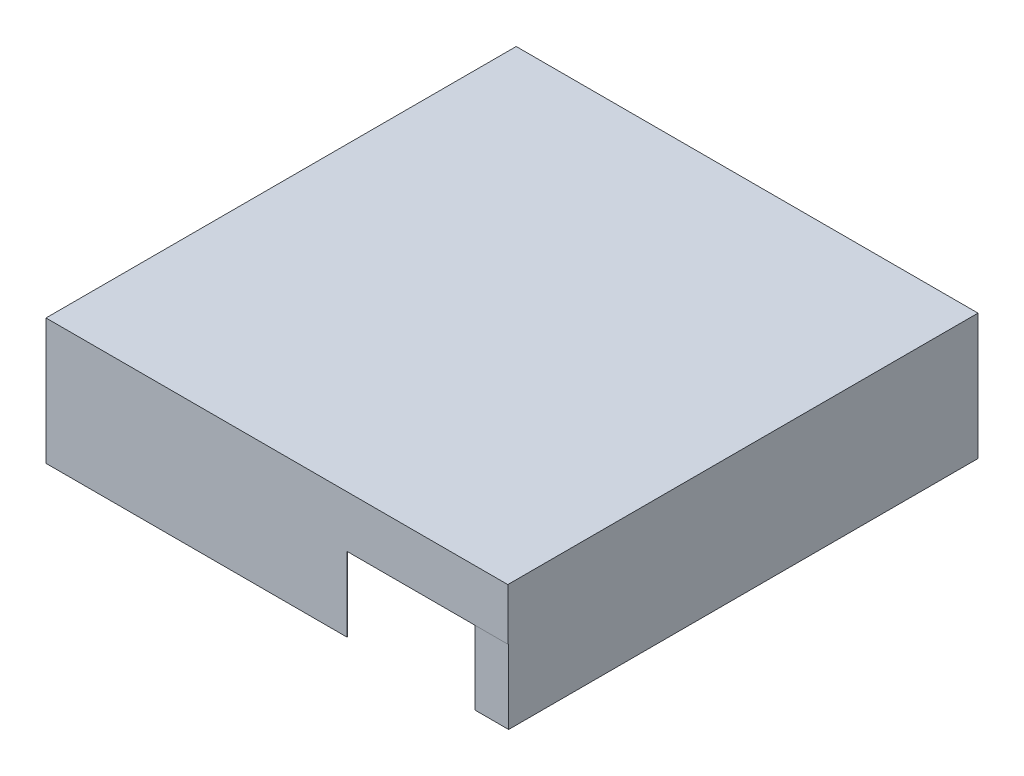
ISO-10303-21;
HEADER;
FILE_DESCRIPTION(('STEP AP214'),'2;1');
FILE_NAME('part.step','',(''),(''),'','','');
FILE_SCHEMA(('AUTOMOTIVE_DESIGN { 1 0 10303 214 1 1 1 1 }'));
ENDSEC;
DATA;
#1=APPLICATION_CONTEXT('core data for automotive mechanical design processes');
#2=APPLICATION_PROTOCOL_DEFINITION('international standard','automotive_design',2000,#1);
#3=PRODUCT_CONTEXT('',#1,'mechanical');
#4=PRODUCT('Part','Part','',(#3));
#5=PRODUCT_RELATED_PRODUCT_CATEGORY('part','',(#4));
#6=PRODUCT_DEFINITION_FORMATION('','',#4);
#7=PRODUCT_DEFINITION_CONTEXT('part definition',#1,'design');
#8=PRODUCT_DEFINITION('design','',#6,#7);
#9=PRODUCT_DEFINITION_SHAPE('','',#8);
#10=(LENGTH_UNIT() NAMED_UNIT(*) SI_UNIT(.MILLI.,.METRE.));
#11=(NAMED_UNIT(*) PLANE_ANGLE_UNIT() SI_UNIT($,.RADIAN.));
#12=(NAMED_UNIT(*) SI_UNIT($,.STERADIAN.) SOLID_ANGLE_UNIT());
#13=UNCERTAINTY_MEASURE_WITH_UNIT(LENGTH_MEASURE(1.E-05),#10,'distance_accuracy_value','');
#14=(GEOMETRIC_REPRESENTATION_CONTEXT(3) GLOBAL_UNCERTAINTY_ASSIGNED_CONTEXT((#13)) GLOBAL_UNIT_ASSIGNED_CONTEXT((#10,
#11,#12)) REPRESENTATION_CONTEXT('',''));
#15=CARTESIAN_POINT('',(0.,0.,0.));
#16=DIRECTION('',(0.,0.,1.));
#17=DIRECTION('',(1.,0.,0.));
#18=AXIS2_PLACEMENT_3D('',#15,#16,#17);
#19=CARTESIAN_POINT('',(0.,0.,0.));
#20=DIRECTION('',(0.,1.,0.));
#21=DIRECTION('',(0.,0.,1.));
#22=AXIS2_PLACEMENT_3D('',#19,#20,#21);
#23=PLANE('',#22);
#24=DIRECTION('',(-1.,0.,0.));
#25=VECTOR('',#24,1.);
#26=CARTESIAN_POINT('',(-11.75,0.,-25.5));
#27=LINE('',#26,#25);
#28=CARTESIAN_POINT('',(-9.25,0.,-25.5));
#29=VERTEX_POINT('',#28);
#30=CARTESIAN_POINT('',(-11.75,0.,-25.5));
#31=VERTEX_POINT('',#30);
#32=EDGE_CURVE('E44',#29,#31,#27,.T.);
#33=ORIENTED_EDGE('',*,*,#32,.T.);
#34=DIRECTION('',(0.,0.,1.));
#35=VECTOR('',#34,1.);
#36=CARTESIAN_POINT('',(-11.75,0.,-0.0500000000000036));
#37=LINE('',#36,#35);
#38=CARTESIAN_POINT('',(-11.75,0.,-0.0500000000000036));
#39=VERTEX_POINT('',#38);
#40=EDGE_CURVE('E278',#31,#39,#37,.T.);
#41=ORIENTED_EDGE('',*,*,#40,.T.);
#42=DIRECTION('',(-1.,0.,0.));
#43=VECTOR('',#42,1.);
#44=CARTESIAN_POINT('',(-11.75,0.,-0.0500000000000036));
#45=LINE('',#44,#43);
#46=CARTESIAN_POINT('',(4.16471791353497,0.,-0.0500000000000049));
#47=VERTEX_POINT('',#46);
#48=EDGE_CURVE('E272',#47,#39,#45,.T.);
#49=ORIENTED_EDGE('',*,*,#48,.F.);
#50=DIRECTION('',(0.,0.,1.));
#51=VECTOR('',#50,1.);
#52=CARTESIAN_POINT('',(4.16471791353497,0.,-13.6995729837994));
#53=LINE('',#52,#51);
#54=CARTESIAN_POINT('',(4.16471791353497,0.,0.));
#55=VERTEX_POINT('',#54);
#56=EDGE_CURVE('E49',#47,#55,#53,.T.);
#57=ORIENTED_EDGE('',*,*,#56,.T.);
#58=DIRECTION('',(1.,0.,0.));
#59=VECTOR('',#58,1.);
#60=CARTESIAN_POINT('',(-13.75,0.,0.));
#61=LINE('',#60,#59);
#62=CARTESIAN_POINT('',(-13.75,0.,0.));
#63=VERTEX_POINT('',#62);
#64=EDGE_CURVE('E281',#63,#55,#61,.T.);
#65=ORIENTED_EDGE('',*,*,#64,.F.);
#66=DIRECTION('',(0.,0.,1.));
#67=VECTOR('',#66,1.);
#68=CARTESIAN_POINT('',(-13.75,0.,0.));
#69=LINE('',#68,#67);
#70=CARTESIAN_POINT('',(-13.75,0.,-28.));
#71=VERTEX_POINT('',#70);
#72=EDGE_CURVE('E269',#71,#63,#69,.T.);
#73=ORIENTED_EDGE('',*,*,#72,.F.);
#74=DIRECTION('',(-1.,0.,0.));
#75=VECTOR('',#74,1.);
#76=CARTESIAN_POINT('',(-13.75,0.,-28.));
#77=LINE('',#76,#75);
#78=CARTESIAN_POINT('',(-9.25,0.,-28.));
#79=VERTEX_POINT('',#78);
#80=EDGE_CURVE('E285',#79,#71,#77,.T.);
#81=ORIENTED_EDGE('',*,*,#80,.F.);
#82=DIRECTION('',(0.,0.,1.));
#83=VECTOR('',#82,1.);
#84=CARTESIAN_POINT('',(-9.25,0.,-25.));
#85=LINE('',#84,#83);
#86=EDGE_CURVE('E277',#79,#29,#85,.T.);
#87=ORIENTED_EDGE('',*,*,#86,.T.);
#88=EDGE_LOOP('',(#33,#41,#49,#57,#65,#73,#81,#87));
#89=FACE_BOUND('',#88,.T.);
#90=ADVANCED_FACE('F41',(#89),#23,.F.);
#91=CARTESIAN_POINT('',(13.75,0.,-28.));
#92=VERTEX_POINT('',#91);
#93=CARTESIAN_POINT('',(9.25,0.,-28.));
#94=VERTEX_POINT('',#93);
#95=EDGE_CURVE('E282',#92,#94,#77,.T.);
#96=ORIENTED_EDGE('',*,*,#95,.F.);
#97=DIRECTION('',(0.,0.,-1.));
#98=VECTOR('',#97,1.);
#99=CARTESIAN_POINT('',(13.75,0.,0.));
#100=LINE('',#99,#98);
#101=CARTESIAN_POINT('',(13.75,0.,-0.0500000000000049));
#102=VERTEX_POINT('',#101);
#103=EDGE_CURVE('E279',#102,#92,#100,.T.);
#104=ORIENTED_EDGE('',*,*,#103,.F.);
#105=DIRECTION('',(-1.,0.,0.));
#106=VECTOR('',#105,1.);
#107=CARTESIAN_POINT('',(-11.75,0.,-0.0500000000000036));
#108=LINE('',#107,#106);
#109=CARTESIAN_POINT('',(11.75,0.,-0.0500000000000049));
#110=VERTEX_POINT('',#109);
#111=EDGE_CURVE('E12',#102,#110,#108,.T.);
#112=ORIENTED_EDGE('',*,*,#111,.T.);
#113=DIRECTION('',(0.,0.,1.));
#114=VECTOR('',#113,1.);
#115=CARTESIAN_POINT('',(11.75,0.,-0.0500000000000049));
#116=LINE('',#115,#114);
#117=CARTESIAN_POINT('',(11.75,0.,-25.5));
#118=VERTEX_POINT('',#117);
#119=EDGE_CURVE('E63',#118,#110,#116,.T.);
#120=ORIENTED_EDGE('',*,*,#119,.F.);
#121=DIRECTION('',(-1.,0.,0.));
#122=VECTOR('',#121,1.);
#123=CARTESIAN_POINT('',(-11.75,0.,-25.5));
#124=LINE('',#123,#122);
#125=CARTESIAN_POINT('',(9.25,0.,-25.5));
#126=VERTEX_POINT('',#125);
#127=EDGE_CURVE('E274',#118,#126,#124,.T.);
#128=ORIENTED_EDGE('',*,*,#127,.T.);
#129=DIRECTION('',(0.,0.,1.));
#130=VECTOR('',#129,1.);
#131=CARTESIAN_POINT('',(9.25,0.,-25.));
#132=LINE('',#131,#130);
#133=EDGE_CURVE('E273',#94,#126,#132,.T.);
#134=ORIENTED_EDGE('',*,*,#133,.F.);
#135=EDGE_LOOP('',(#96,#104,#112,#120,#128,#134));
#136=FACE_BOUND('',#135,.T.);
#137=ADVANCED_FACE('F360',(#136),#23,.F.);
#138=CARTESIAN_POINT('',(-13.75,7.5,0.));
#139=DIRECTION('',(0.,0.,-1.));
#140=DIRECTION('',(-1.,0.,0.));
#141=AXIS2_PLACEMENT_3D('',#138,#139,#140);
#142=PLANE('',#141);
#143=DIRECTION('',(0.,-1.,0.));
#144=VECTOR('',#143,1.);
#145=CARTESIAN_POINT('',(-13.75,7.5,0.));
#146=LINE('',#145,#144);
#147=CARTESIAN_POINT('',(-13.75,7.5,0.));
#148=VERTEX_POINT('',#147);
#149=EDGE_CURVE('E255',#148,#63,#146,.T.);
#150=ORIENTED_EDGE('',*,*,#149,.T.);
#151=ORIENTED_EDGE('',*,*,#64,.T.);
#152=DIRECTION('',(0.,-1.,0.));
#153=VECTOR('',#152,1.);
#154=CARTESIAN_POINT('',(4.16471791353497,7.5,0.));
#155=LINE('',#154,#153);
#156=CARTESIAN_POINT('',(4.16471791353497,4.42501278313102,0.));
#157=VERTEX_POINT('',#156);
#158=EDGE_CURVE('E267',#157,#55,#155,.T.);
#159=ORIENTED_EDGE('',*,*,#158,.F.);
#160=DIRECTION('',(1.,0.,0.));
#161=VECTOR('',#160,1.);
#162=CARTESIAN_POINT('',(-13.75,4.42501278313102,0.));
#163=LINE('',#162,#161);
#164=CARTESIAN_POINT('',(13.75,4.42501278313102,0.));
#165=VERTEX_POINT('',#164);
#166=EDGE_CURVE('E190',#157,#165,#163,.T.);
#167=ORIENTED_EDGE('',*,*,#166,.T.);
#168=DIRECTION('',(0.,-1.,0.));
#169=VECTOR('',#168,1.);
#170=CARTESIAN_POINT('',(13.75,7.5,0.));
#171=LINE('',#170,#169);
#172=CARTESIAN_POINT('',(13.75,7.5,0.));
#173=VERTEX_POINT('',#172);
#174=EDGE_CURVE('E183',#173,#165,#171,.T.);
#175=ORIENTED_EDGE('',*,*,#174,.F.);
#176=DIRECTION('',(1.,0.,0.));
#177=VECTOR('',#176,1.);
#178=CARTESIAN_POINT('',(-13.75,7.5,0.));
#179=LINE('',#178,#177);
#180=EDGE_CURVE('E242',#148,#173,#179,.T.);
#181=ORIENTED_EDGE('',*,*,#180,.F.);
#182=EDGE_LOOP('',(#150,#151,#159,#167,#175,#181));
#183=FACE_BOUND('',#182,.T.);
#184=ADVANCED_FACE('F323',(#183),#142,.F.);
#185=CARTESIAN_POINT('',(13.75,7.5,0.));
#186=DIRECTION('',(-1.,0.,0.));
#187=DIRECTION('',(0.,0.,1.));
#188=AXIS2_PLACEMENT_3D('',#185,#186,#187);
#189=PLANE('',#188);
#190=DIRECTION('',(0.,-1.,0.));
#191=VECTOR('',#190,1.);
#192=CARTESIAN_POINT('',(13.75,-5.29266234845059,-0.0500000000000049));
#193=LINE('',#192,#191);
#194=CARTESIAN_POINT('',(13.75,4.42501278313102,-0.0500000000000049));
#195=VERTEX_POINT('',#194);
#196=EDGE_CURVE('E172',#195,#102,#193,.T.);
#197=ORIENTED_EDGE('',*,*,#196,.T.);
#198=ORIENTED_EDGE('',*,*,#103,.T.);
#199=DIRECTION('',(0.,-1.,0.));
#200=VECTOR('',#199,1.);
#201=CARTESIAN_POINT('',(13.75,7.5,-28.));
#202=LINE('',#201,#200);
#203=CARTESIAN_POINT('',(13.75,7.5,-28.));
#204=VERTEX_POINT('',#203);
#205=EDGE_CURVE('E251',#204,#92,#202,.T.);
#206=ORIENTED_EDGE('',*,*,#205,.F.);
#207=DIRECTION('',(0.,0.,-1.));
#208=VECTOR('',#207,1.);
#209=CARTESIAN_POINT('',(13.75,7.5,0.));
#210=LINE('',#209,#208);
#211=EDGE_CURVE('E244',#173,#204,#210,.T.);
#212=ORIENTED_EDGE('',*,*,#211,.F.);
#213=ORIENTED_EDGE('',*,*,#174,.T.);
#214=DIRECTION('',(0.,0.,1.));
#215=VECTOR('',#214,1.);
#216=CARTESIAN_POINT('',(13.75,4.42501278313102,-13.6995729837994));
#217=LINE('',#216,#215);
#218=EDGE_CURVE('E167',#195,#165,#217,.T.);
#219=ORIENTED_EDGE('',*,*,#218,.F.);
#220=EDGE_LOOP('',(#197,#198,#206,#212,#213,#219));
#221=FACE_BOUND('',#220,.T.);
#222=ADVANCED_FACE('F180',(#221),#189,.F.);
#223=CARTESIAN_POINT('',(-11.75,-6.1,-25.5));
#224=DIRECTION('',(0.,0.,1.));
#225=DIRECTION('',(1.,0.,0.));
#226=AXIS2_PLACEMENT_3D('',#223,#224,#225);
#227=PLANE('',#226);
#228=ORIENTED_EDGE('',*,*,#32,.F.);
#229=DIRECTION('',(0.,1.,0.));
#230=VECTOR('',#229,1.);
#231=CARTESIAN_POINT('',(-9.25,-6.1,-25.5));
#232=LINE('',#231,#230);
#233=CARTESIAN_POINT('',(-9.25,6.1,-25.5));
#234=VERTEX_POINT('',#233);
#235=EDGE_CURVE('E216',#29,#234,#232,.T.);
#236=ORIENTED_EDGE('',*,*,#235,.T.);
#237=DIRECTION('',(1.,0.,0.));
#238=VECTOR('',#237,1.);
#239=CARTESIAN_POINT('',(-11.75,6.1,-25.5));
#240=LINE('',#239,#238);
#241=CARTESIAN_POINT('',(-11.75,6.1,-25.5));
#242=VERTEX_POINT('',#241);
#243=EDGE_CURVE('E225',#242,#234,#240,.T.);
#244=ORIENTED_EDGE('',*,*,#243,.F.);
#245=DIRECTION('',(0.,1.,0.));
#246=VECTOR('',#245,1.);
#247=CARTESIAN_POINT('',(-11.75,-6.1,-25.5));
#248=LINE('',#247,#246);
#249=EDGE_CURVE('E235',#31,#242,#248,.T.);
#250=ORIENTED_EDGE('',*,*,#249,.F.);
#251=EDGE_LOOP('',(#228,#236,#244,#250));
#252=FACE_BOUND('',#251,.T.);
#253=ADVANCED_FACE('F303',(#252),#227,.T.);
#254=CARTESIAN_POINT('',(0.,6.1,0.));
#255=DIRECTION('',(0.,1.,0.));
#256=DIRECTION('',(0.,0.,1.));
#257=AXIS2_PLACEMENT_3D('',#254,#255,#256);
#258=PLANE('',#257);
#259=DIRECTION('',(0.,0.,-1.));
#260=VECTOR('',#259,1.);
#261=CARTESIAN_POINT('',(-9.25,6.1,0.));
#262=LINE('',#261,#260);
#263=CARTESIAN_POINT('',(-9.25,6.1,-25.));
#264=VERTEX_POINT('',#263);
#265=EDGE_CURVE('E264',#264,#234,#262,.T.);
#266=ORIENTED_EDGE('',*,*,#265,.F.);
#267=DIRECTION('',(1.,0.,0.));
#268=VECTOR('',#267,1.);
#269=CARTESIAN_POINT('',(0.,6.1,-25.));
#270=LINE('',#269,#268);
#271=CARTESIAN_POINT('',(9.25,6.1,-25.));
#272=VERTEX_POINT('',#271);
#273=EDGE_CURVE('E258',#264,#272,#270,.T.);
#274=ORIENTED_EDGE('',*,*,#273,.T.);
#275=DIRECTION('',(0.,0.,-1.));
#276=VECTOR('',#275,1.);
#277=CARTESIAN_POINT('',(9.25,6.1,0.));
#278=LINE('',#277,#276);
#279=CARTESIAN_POINT('',(9.25,6.1,-25.5));
#280=VERTEX_POINT('',#279);
#281=EDGE_CURVE('E261',#272,#280,#278,.T.);
#282=ORIENTED_EDGE('',*,*,#281,.T.);
#283=CARTESIAN_POINT('',(11.75,6.1,-25.5));
#284=VERTEX_POINT('',#283);
#285=EDGE_CURVE('E224',#280,#284,#240,.T.);
#286=ORIENTED_EDGE('',*,*,#285,.T.);
#287=DIRECTION('',(0.,0.,-1.));
#288=VECTOR('',#287,1.);
#289=CARTESIAN_POINT('',(11.75,6.1,-0.0500000000000049));
#290=LINE('',#289,#288);
#291=CARTESIAN_POINT('',(11.75,6.1,-0.0500000000000049));
#292=VERTEX_POINT('',#291);
#293=EDGE_CURVE('E221',#292,#284,#290,.T.);
#294=ORIENTED_EDGE('',*,*,#293,.F.);
#295=DIRECTION('',(1.,0.,0.));
#296=VECTOR('',#295,1.);
#297=CARTESIAN_POINT('',(-11.75,6.1,-0.0500000000000036));
#298=LINE('',#297,#296);
#299=CARTESIAN_POINT('',(-11.75,6.1,-0.0500000000000036));
#300=VERTEX_POINT('',#299);
#301=EDGE_CURVE('E218',#300,#292,#298,.T.);
#302=ORIENTED_EDGE('',*,*,#301,.F.);
#303=DIRECTION('',(0.,0.,-1.));
#304=VECTOR('',#303,1.);
#305=CARTESIAN_POINT('',(-11.75,6.1,-0.0500000000000036));
#306=LINE('',#305,#304);
#307=EDGE_CURVE('E228',#300,#242,#306,.T.);
#308=ORIENTED_EDGE('',*,*,#307,.T.);
#309=ORIENTED_EDGE('',*,*,#243,.T.);
#310=EDGE_LOOP('',(#266,#274,#282,#286,#294,#302,#308,#309));
#311=FACE_BOUND('',#310,.T.);
#312=ADVANCED_FACE('F310',(#311),#258,.F.);
#313=CARTESIAN_POINT('',(-11.75,-6.1,-0.0500000000000036));
#314=DIRECTION('',(0.,0.,1.));
#315=DIRECTION('',(1.,0.,0.));
#316=AXIS2_PLACEMENT_3D('',#313,#314,#315);
#317=PLANE('',#316);
#318=DIRECTION('',(0.,-1.,0.));
#319=VECTOR('',#318,1.);
#320=CARTESIAN_POINT('',(4.16471791353497,-5.29266234845059,-0.0500000000000049));
#321=LINE('',#320,#319);
#322=CARTESIAN_POINT('',(4.16471791353497,4.42501278313102,-0.0500000000000049));
#323=VERTEX_POINT('',#322);
#324=EDGE_CURVE('E177',#323,#47,#321,.T.);
#325=ORIENTED_EDGE('',*,*,#324,.T.);
#326=ORIENTED_EDGE('',*,*,#48,.T.);
#327=DIRECTION('',(0.,1.,0.));
#328=VECTOR('',#327,1.);
#329=CARTESIAN_POINT('',(-11.75,-6.1,-0.0500000000000036));
#330=LINE('',#329,#328);
#331=EDGE_CURVE('E232',#39,#300,#330,.T.);
#332=ORIENTED_EDGE('',*,*,#331,.T.);
#333=ORIENTED_EDGE('',*,*,#301,.T.);
#334=DIRECTION('',(0.,1.,0.));
#335=VECTOR('',#334,1.);
#336=CARTESIAN_POINT('',(11.75,-6.1,-0.0500000000000049));
#337=LINE('',#336,#335);
#338=CARTESIAN_POINT('',(11.75,4.42501278313102,-0.0500000000000048));
#339=VERTEX_POINT('',#338);
#340=EDGE_CURVE('E231',#339,#292,#337,.T.);
#341=ORIENTED_EDGE('',*,*,#340,.F.);
#342=DIRECTION('',(1.,0.,0.));
#343=VECTOR('',#342,1.);
#344=CARTESIAN_POINT('',(13.75,4.42501278313102,-0.0500000000000049));
#345=LINE('',#344,#343);
#346=EDGE_CURVE('E170',#323,#339,#345,.T.);
#347=ORIENTED_EDGE('',*,*,#346,.F.);
#348=EDGE_LOOP('',(#325,#326,#332,#333,#341,#347));
#349=FACE_BOUND('',#348,.T.);
#350=ADVANCED_FACE('F315',(#349),#317,.F.);
#351=CARTESIAN_POINT('',(-11.75,-6.1,-0.0500000000000036));
#352=DIRECTION('',(1.,0.,0.));
#353=DIRECTION('',(0.,0.,-1.));
#354=AXIS2_PLACEMENT_3D('',#351,#352,#353);
#355=PLANE('',#354);
#356=ORIENTED_EDGE('',*,*,#40,.F.);
#357=ORIENTED_EDGE('',*,*,#249,.T.);
#358=ORIENTED_EDGE('',*,*,#307,.F.);
#359=ORIENTED_EDGE('',*,*,#331,.F.);
#360=EDGE_LOOP('',(#356,#357,#358,#359));
#361=FACE_BOUND('',#360,.T.);
#362=ADVANCED_FACE('F306',(#361),#355,.T.);
#363=ORIENTED_EDGE('',*,*,#127,.F.);
#364=DIRECTION('',(0.,1.,0.));
#365=VECTOR('',#364,1.);
#366=CARTESIAN_POINT('',(11.75,-6.1,-25.5));
#367=LINE('',#366,#365);
#368=EDGE_CURVE('E237',#118,#284,#367,.T.);
#369=ORIENTED_EDGE('',*,*,#368,.T.);
#370=ORIENTED_EDGE('',*,*,#285,.F.);
#371=DIRECTION('',(0.,1.,0.));
#372=VECTOR('',#371,1.);
#373=CARTESIAN_POINT('',(9.25,-6.09999999999999,-25.5));
#374=LINE('',#373,#372);
#375=EDGE_CURVE('E214',#126,#280,#374,.T.);
#376=ORIENTED_EDGE('',*,*,#375,.F.);
#377=EDGE_LOOP('',(#363,#369,#370,#376));
#378=FACE_BOUND('',#377,.T.);
#379=ADVANCED_FACE('F347',(#378),#227,.T.);
#380=CARTESIAN_POINT('',(11.75,-6.1,-0.0500000000000049));
#381=DIRECTION('',(1.,0.,0.));
#382=DIRECTION('',(0.,0.,-1.));
#383=AXIS2_PLACEMENT_3D('',#380,#381,#382);
#384=PLANE('',#383);
#385=ORIENTED_EDGE('',*,*,#368,.F.);
#386=ORIENTED_EDGE('',*,*,#119,.T.);
#387=EDGE_CURVE('E189',#110,#339,#337,.T.);
#388=ORIENTED_EDGE('',*,*,#387,.T.);
#389=ORIENTED_EDGE('',*,*,#340,.T.);
#390=ORIENTED_EDGE('',*,*,#293,.T.);
#391=EDGE_LOOP('',(#385,#386,#388,#389,#390));
#392=FACE_BOUND('',#391,.T.);
#393=ADVANCED_FACE('F348',(#392),#384,.F.);
#394=CARTESIAN_POINT('',(0.,0.,-25.));
#395=DIRECTION('',(0.,0.,1.));
#396=DIRECTION('',(1.,0.,0.));
#397=AXIS2_PLACEMENT_3D('',#394,#395,#396);
#398=PLANE('',#397);
#399=DIRECTION('',(0.,-1.,0.));
#400=VECTOR('',#399,1.);
#401=CARTESIAN_POINT('',(-9.25,6.15,-25.));
#402=LINE('',#401,#400);
#403=CARTESIAN_POINT('',(-9.25,6.15,-25.));
#404=VERTEX_POINT('',#403);
#405=EDGE_CURVE('E193',#404,#264,#402,.T.);
#406=ORIENTED_EDGE('',*,*,#405,.F.);
#407=DIRECTION('',(1.,0.,0.));
#408=VECTOR('',#407,1.);
#409=CARTESIAN_POINT('',(-9.25,6.15,-25.));
#410=LINE('',#409,#408);
#411=CARTESIAN_POINT('',(9.25,6.15,-25.));
#412=VERTEX_POINT('',#411);
#413=EDGE_CURVE('E199',#404,#412,#410,.T.);
#414=ORIENTED_EDGE('',*,*,#413,.T.);
#415=DIRECTION('',(0.,-1.,0.));
#416=VECTOR('',#415,1.);
#417=CARTESIAN_POINT('',(9.25,6.15,-25.));
#418=LINE('',#417,#416);
#419=EDGE_CURVE('E196',#412,#272,#418,.T.);
#420=ORIENTED_EDGE('',*,*,#419,.T.);
#421=ORIENTED_EDGE('',*,*,#273,.F.);
#422=EDGE_LOOP('',(#406,#414,#420,#421));
#423=FACE_BOUND('',#422,.T.);
#424=ADVANCED_FACE('F341',(#423),#398,.F.);
#425=CARTESIAN_POINT('',(-9.25,6.15,-25.));
#426=DIRECTION('',(1.,0.,0.));
#427=DIRECTION('',(0.,1.,0.));
#428=AXIS2_PLACEMENT_3D('',#425,#426,#427);
#429=PLANE('',#428);
#430=ORIENTED_EDGE('',*,*,#86,.F.);
#431=DIRECTION('',(0.,-1.,0.));
#432=VECTOR('',#431,1.);
#433=CARTESIAN_POINT('',(-9.25,6.15,-28.));
#434=LINE('',#433,#432);
#435=CARTESIAN_POINT('',(-9.25,6.15,-28.));
#436=VERTEX_POINT('',#435);
#437=EDGE_CURVE('E192',#436,#79,#434,.T.);
#438=ORIENTED_EDGE('',*,*,#437,.F.);
#439=DIRECTION('',(0.,0.,-1.));
#440=VECTOR('',#439,1.);
#441=CARTESIAN_POINT('',(-9.25,6.15,-25.));
#442=LINE('',#441,#440);
#443=EDGE_CURVE('E202',#404,#436,#442,.T.);
#444=ORIENTED_EDGE('',*,*,#443,.F.);
#445=ORIENTED_EDGE('',*,*,#405,.T.);
#446=ORIENTED_EDGE('',*,*,#265,.T.);
#447=ORIENTED_EDGE('',*,*,#235,.F.);
#448=EDGE_LOOP('',(#430,#438,#444,#445,#446,#447));
#449=FACE_BOUND('',#448,.T.);
#450=ADVANCED_FACE('F334',(#449),#429,.T.);
#451=CARTESIAN_POINT('',(9.25,6.15,-25.));
#452=DIRECTION('',(1.,0.,0.));
#453=DIRECTION('',(0.,1.,0.));
#454=AXIS2_PLACEMENT_3D('',#451,#452,#453);
#455=PLANE('',#454);
#456=DIRECTION('',(0.,-1.,0.));
#457=VECTOR('',#456,1.);
#458=CARTESIAN_POINT('',(9.25,6.15,-28.));
#459=LINE('',#458,#457);
#460=CARTESIAN_POINT('',(9.25,6.15,-28.));
#461=VERTEX_POINT('',#460);
#462=EDGE_CURVE('E205',#461,#94,#459,.T.);
#463=ORIENTED_EDGE('',*,*,#462,.T.);
#464=ORIENTED_EDGE('',*,*,#133,.T.);
#465=ORIENTED_EDGE('',*,*,#375,.T.);
#466=ORIENTED_EDGE('',*,*,#281,.F.);
#467=ORIENTED_EDGE('',*,*,#419,.F.);
#468=DIRECTION('',(0.,0.,-1.));
#469=VECTOR('',#468,1.);
#470=CARTESIAN_POINT('',(9.25,6.15,-25.));
#471=LINE('',#470,#469);
#472=EDGE_CURVE('E212',#412,#461,#471,.T.);
#473=ORIENTED_EDGE('',*,*,#472,.T.);
#474=EDGE_LOOP('',(#463,#464,#465,#466,#467,#473));
#475=FACE_BOUND('',#474,.T.);
#476=ADVANCED_FACE('F383',(#475),#455,.F.);
#477=CARTESIAN_POINT('',(-9.25,6.15,-25.));
#478=DIRECTION('',(0.,1.,0.));
#479=DIRECTION('',(0.,0.,1.));
#480=AXIS2_PLACEMENT_3D('',#477,#478,#479);
#481=PLANE('',#480);
#482=DIRECTION('',(1.,0.,0.));
#483=VECTOR('',#482,1.);
#484=CARTESIAN_POINT('',(-9.25,6.15,-28.));
#485=LINE('',#484,#483);
#486=EDGE_CURVE('E197',#436,#461,#485,.T.);
#487=ORIENTED_EDGE('',*,*,#486,.T.);
#488=ORIENTED_EDGE('',*,*,#472,.F.);
#489=ORIENTED_EDGE('',*,*,#413,.F.);
#490=ORIENTED_EDGE('',*,*,#443,.T.);
#491=EDGE_LOOP('',(#487,#488,#489,#490));
#492=FACE_BOUND('',#491,.T.);
#493=ADVANCED_FACE('F338',(#492),#481,.F.);
#494=CARTESIAN_POINT('',(-13.75,7.5,-28.));
#495=DIRECTION('',(0.,0.,1.));
#496=DIRECTION('',(1.,0.,0.));
#497=AXIS2_PLACEMENT_3D('',#494,#495,#496);
#498=PLANE('',#497);
#499=ORIENTED_EDGE('',*,*,#205,.T.);
#500=ORIENTED_EDGE('',*,*,#95,.T.);
#501=ORIENTED_EDGE('',*,*,#462,.F.);
#502=ORIENTED_EDGE('',*,*,#486,.F.);
#503=ORIENTED_EDGE('',*,*,#437,.T.);
#504=ORIENTED_EDGE('',*,*,#80,.T.);
#505=DIRECTION('',(0.,-1.,0.));
#506=VECTOR('',#505,1.);
#507=CARTESIAN_POINT('',(-13.75,7.5,-28.));
#508=LINE('',#507,#506);
#509=CARTESIAN_POINT('',(-13.75,7.5,-28.));
#510=VERTEX_POINT('',#509);
#511=EDGE_CURVE('E248',#510,#71,#508,.T.);
#512=ORIENTED_EDGE('',*,*,#511,.F.);
#513=DIRECTION('',(-1.,0.,0.));
#514=VECTOR('',#513,1.);
#515=CARTESIAN_POINT('',(-13.75,7.5,-28.));
#516=LINE('',#515,#514);
#517=EDGE_CURVE('E246',#204,#510,#516,.T.);
#518=ORIENTED_EDGE('',*,*,#517,.F.);
#519=EDGE_LOOP('',(#499,#500,#501,#502,#503,#504,#512,#518));
#520=FACE_BOUND('',#519,.T.);
#521=ADVANCED_FACE('F331',(#520),#498,.F.);
#522=CARTESIAN_POINT('',(-13.75,7.5,0.));
#523=DIRECTION('',(1.,0.,0.));
#524=DIRECTION('',(0.,0.,-1.));
#525=AXIS2_PLACEMENT_3D('',#522,#523,#524);
#526=PLANE('',#525);
#527=ORIENTED_EDGE('',*,*,#511,.T.);
#528=ORIENTED_EDGE('',*,*,#72,.T.);
#529=ORIENTED_EDGE('',*,*,#149,.F.);
#530=DIRECTION('',(0.,0.,1.));
#531=VECTOR('',#530,1.);
#532=CARTESIAN_POINT('',(-13.75,7.5,0.));
#533=LINE('',#532,#531);
#534=EDGE_CURVE('E234',#510,#148,#533,.T.);
#535=ORIENTED_EDGE('',*,*,#534,.F.);
#536=EDGE_LOOP('',(#527,#528,#529,#535));
#537=FACE_BOUND('',#536,.T.);
#538=ADVANCED_FACE('F327',(#537),#526,.F.);
#539=CARTESIAN_POINT('',(0.,7.5,0.));
#540=DIRECTION('',(0.,-1.,0.));
#541=DIRECTION('',(0.,0.,-1.));
#542=AXIS2_PLACEMENT_3D('',#539,#540,#541);
#543=PLANE('',#542);
#544=ORIENTED_EDGE('',*,*,#534,.T.);
#545=ORIENTED_EDGE('',*,*,#180,.T.);
#546=ORIENTED_EDGE('',*,*,#211,.T.);
#547=ORIENTED_EDGE('',*,*,#517,.T.);
#548=EDGE_LOOP('',(#544,#545,#546,#547));
#549=FACE_BOUND('',#548,.T.);
#550=ADVANCED_FACE('F379',(#549),#543,.F.);
#551=CARTESIAN_POINT('',(4.16471791353497,-5.29266234845059,-13.6995729837994));
#552=DIRECTION('',(1.,0.,0.));
#553=DIRECTION('',(0.,0.,-1.));
#554=AXIS2_PLACEMENT_3D('',#551,#552,#553);
#555=PLANE('',#554);
#556=ORIENTED_EDGE('',*,*,#56,.F.);
#557=ORIENTED_EDGE('',*,*,#324,.F.);
#558=DIRECTION('',(0.,0.,1.));
#559=VECTOR('',#558,1.);
#560=CARTESIAN_POINT('',(4.16471791353497,4.42501278313102,-13.6995729837994));
#561=LINE('',#560,#559);
#562=EDGE_CURVE('E184',#323,#157,#561,.T.);
#563=ORIENTED_EDGE('',*,*,#562,.T.);
#564=ORIENTED_EDGE('',*,*,#158,.T.);
#565=EDGE_LOOP('',(#556,#557,#563,#564));
#566=FACE_BOUND('',#565,.T.);
#567=ADVANCED_FACE('F321',(#566),#555,.T.);
#568=CARTESIAN_POINT('',(13.75,4.42501278313102,-13.6995729837994));
#569=DIRECTION('',(0.,1.,0.));
#570=DIRECTION('',(0.,0.,1.));
#571=AXIS2_PLACEMENT_3D('',#568,#569,#570);
#572=PLANE('',#571);
#573=ORIENTED_EDGE('',*,*,#562,.F.);
#574=ORIENTED_EDGE('',*,*,#346,.T.);
#575=EDGE_CURVE('E164',#339,#195,#345,.T.);
#576=ORIENTED_EDGE('',*,*,#575,.T.);
#577=ORIENTED_EDGE('',*,*,#218,.T.);
#578=ORIENTED_EDGE('',*,*,#166,.F.);
#579=EDGE_LOOP('',(#573,#574,#576,#577,#578));
#580=FACE_BOUND('',#579,.T.);
#581=ADVANCED_FACE('F165',(#580),#572,.F.);
#582=CARTESIAN_POINT('',(-11.75,-6.1,-0.0500000000000036));
#583=DIRECTION('',(0.,0.,1.));
#584=DIRECTION('',(1.,0.,0.));
#585=AXIS2_PLACEMENT_3D('',#582,#583,#584);
#586=PLANE('',#585);
#587=ORIENTED_EDGE('',*,*,#111,.F.);
#588=ORIENTED_EDGE('',*,*,#196,.F.);
#589=ORIENTED_EDGE('',*,*,#575,.F.);
#590=ORIENTED_EDGE('',*,*,#387,.F.);
#591=EDGE_LOOP('',(#587,#588,#589,#590));
#592=FACE_BOUND('',#591,.T.);
#593=ADVANCED_FACE('F175',(#592),#586,.T.);
#594=CLOSED_SHELL('',(#90,#137,#184,#222,#253,#312,#350,#362,#379,#393,#424,#450,#476,#493,#521,
#538,#550,#567,#581,#593));
#595=MANIFOLD_SOLID_BREP('B2',#594);
#596=ADVANCED_BREP_SHAPE_REPRESENTATION('',(#18,#595),#14);
#597=SHAPE_DEFINITION_REPRESENTATION(#9,#596);
ENDSEC;
END-ISO-10303-21;
